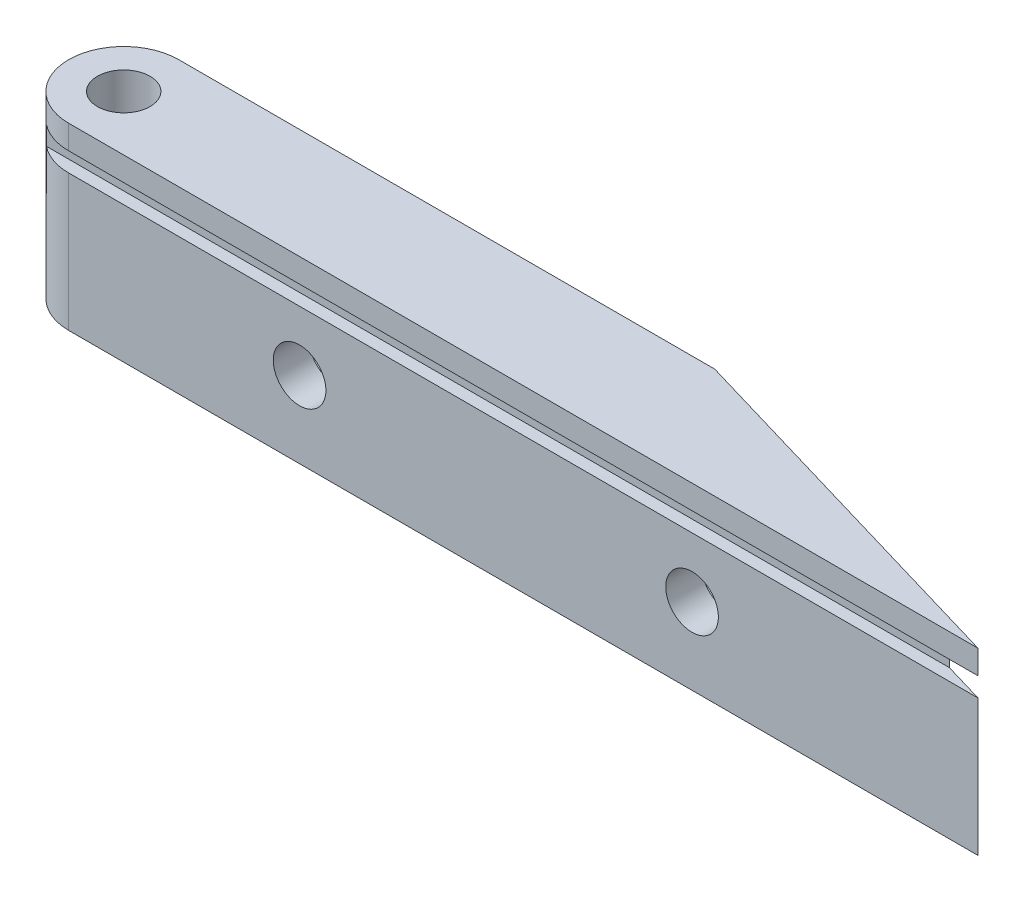
ISO-10303-21;
HEADER;
FILE_DESCRIPTION(('STEP AP214'),'2;1');
FILE_NAME('part.step','',(''),(''),'','','');
FILE_SCHEMA(('AUTOMOTIVE_DESIGN { 1 0 10303 214 1 1 1 1 }'));
ENDSEC;
DATA;
#1=APPLICATION_CONTEXT('core data for automotive mechanical design processes');
#2=APPLICATION_PROTOCOL_DEFINITION('international standard','automotive_design',2000,#1);
#3=PRODUCT_CONTEXT('',#1,'mechanical');
#4=PRODUCT('Part','Part','',(#3));
#5=PRODUCT_RELATED_PRODUCT_CATEGORY('part','',(#4));
#6=PRODUCT_DEFINITION_FORMATION('','',#4);
#7=PRODUCT_DEFINITION_CONTEXT('part definition',#1,'design');
#8=PRODUCT_DEFINITION('design','',#6,#7);
#9=PRODUCT_DEFINITION_SHAPE('','',#8);
#10=(LENGTH_UNIT() NAMED_UNIT(*) SI_UNIT(.MILLI.,.METRE.));
#11=(NAMED_UNIT(*) PLANE_ANGLE_UNIT() SI_UNIT($,.RADIAN.));
#12=(NAMED_UNIT(*) SI_UNIT($,.STERADIAN.) SOLID_ANGLE_UNIT());
#13=UNCERTAINTY_MEASURE_WITH_UNIT(LENGTH_MEASURE(1.E-05),#10,'distance_accuracy_value','');
#14=(GEOMETRIC_REPRESENTATION_CONTEXT(3) GLOBAL_UNCERTAINTY_ASSIGNED_CONTEXT((#13)) GLOBAL_UNIT_ASSIGNED_CONTEXT((#10,
#11,#12)) REPRESENTATION_CONTEXT('',''));
#15=CARTESIAN_POINT('',(0.,0.,0.));
#16=DIRECTION('',(0.,0.,1.));
#17=DIRECTION('',(1.,0.,0.));
#18=AXIS2_PLACEMENT_3D('',#15,#16,#17);
#19=CARTESIAN_POINT('',(22.1200000000001,7.5,1.79999999999999));
#20=DIRECTION('',(0.,0.,-1.));
#21=DIRECTION('',(-1.,0.,0.));
#22=AXIS2_PLACEMENT_3D('',#19,#20,#21);
#23=PLANE('',#22);
#24=DIRECTION('',(0.,-1.,0.));
#25=VECTOR('',#24,1.);
#26=CARTESIAN_POINT('',(-15.8799999999999,7.5,1.8));
#27=LINE('',#26,#25);
#28=CARTESIAN_POINT('',(-15.8799999999999,7.5,1.8));
#29=VERTEX_POINT('',#28);
#30=CARTESIAN_POINT('',(-15.8799999999999,6.49999999999999,1.8));
#31=VERTEX_POINT('',#30);
#32=EDGE_CURVE('E197',#29,#31,#27,.T.);
#33=ORIENTED_EDGE('',*,*,#32,.T.);
#34=DIRECTION('',(1.,0.,0.));
#35=VECTOR('',#34,1.);
#36=CARTESIAN_POINT('',(22.1200000000001,6.5,1.79999999999999));
#37=LINE('',#36,#35);
#38=CARTESIAN_POINT('',(22.1200000000001,6.5,1.8));
#39=VERTEX_POINT('',#38);
#40=EDGE_CURVE('E61',#31,#39,#37,.T.);
#41=ORIENTED_EDGE('',*,*,#40,.T.);
#42=DIRECTION('',(0.,-1.,0.));
#43=VECTOR('',#42,1.);
#44=CARTESIAN_POINT('',(22.1200000000001,7.5,1.79999999999999));
#45=LINE('',#44,#43);
#46=CARTESIAN_POINT('',(22.1200000000001,7.5,1.79999999999999));
#47=VERTEX_POINT('',#46);
#48=EDGE_CURVE('E185',#47,#39,#45,.T.);
#49=ORIENTED_EDGE('',*,*,#48,.F.);
#50=DIRECTION('',(1.,0.,0.));
#51=VECTOR('',#50,1.);
#52=CARTESIAN_POINT('',(22.1200000000001,7.5,1.79999999999999));
#53=LINE('',#52,#51);
#54=EDGE_CURVE('E321',#29,#47,#53,.T.);
#55=ORIENTED_EDGE('',*,*,#54,.F.);
#56=EDGE_LOOP('',(#33,#41,#49,#55));
#57=FACE_BOUND('',#56,.T.);
#58=ADVANCED_FACE('F51',(#57),#23,.F.);
#59=CARTESIAN_POINT('',(-15.8799999999999,7.5,-0.500000000000001));
#60=DIRECTION('',(0.,-1.,0.));
#61=DIRECTION('',(0.,0.,-1.));
#62=AXIS2_PLACEMENT_3D('',#59,#60,#61);
#63=CYLINDRICAL_SURFACE('',#62,1.1);
#64=CARTESIAN_POINT('',(-15.8799999999999,7.5,-0.500000000000001));
#65=DIRECTION('',(0.,1.,0.));
#66=DIRECTION('',(0.,0.,1.));
#67=AXIS2_PLACEMENT_3D('',#64,#65,#66);
#68=CIRCLE('',#67,1.1);
#69=CARTESIAN_POINT('',(-15.8799999999999,7.5,0.6));
#70=VERTEX_POINT('',#69);
#71=EDGE_CURVE('E309',#70,#70,#68,.T.);
#72=ORIENTED_EDGE('',*,*,#71,.T.);
#73=EDGE_LOOP('',(#72));
#74=FACE_BOUND('',#73,.T.);
#75=CARTESIAN_POINT('',(-15.8799999999999,0.,-0.500000000000001));
#76=DIRECTION('',(0.,1.,0.));
#77=DIRECTION('',(0.,0.,1.));
#78=AXIS2_PLACEMENT_3D('',#75,#76,#77);
#79=CIRCLE('',#78,1.1);
#80=CARTESIAN_POINT('',(-15.8799999999999,0.,0.6));
#81=VERTEX_POINT('',#80);
#82=EDGE_CURVE('E299',#81,#81,#79,.T.);
#83=ORIENTED_EDGE('',*,*,#82,.F.);
#84=EDGE_LOOP('',(#83));
#85=FACE_BOUND('',#84,.T.);
#86=ADVANCED_FACE('F455',(#74,#85),#63,.F.);
#87=CARTESIAN_POINT('',(-15.8799999999999,7.,-0.500000000000001));
#88=DIRECTION('',(0.,1.,0.));
#89=DIRECTION('',(0.,0.,1.));
#90=AXIS2_PLACEMENT_3D('',#87,#88,#89);
#91=PLANE('',#90);
#92=DIRECTION('',(0.,0.,1.));
#93=VECTOR('',#92,1.);
#94=CARTESIAN_POINT('',(-15.8799999999999,7.,0.299999999999997));
#95=LINE('',#94,#93);
#96=CARTESIAN_POINT('',(-15.8799999999999,7.,1.1));
#97=VERTEX_POINT('',#96);
#98=CARTESIAN_POINT('',(-15.8799999999999,7.,1.3));
#99=VERTEX_POINT('',#98);
#100=EDGE_CURVE('E255',#97,#99,#95,.T.);
#101=ORIENTED_EDGE('',*,*,#100,.T.);
#102=CARTESIAN_POINT('',(-15.8799999999999,7.,-0.500000000000001));
#103=DIRECTION('',(0.,1.,0.));
#104=DIRECTION('',(0.,0.,1.));
#105=AXIS2_PLACEMENT_3D('',#102,#103,#104);
#106=CIRCLE('',#105,1.8);
#107=CARTESIAN_POINT('',(-15.8799999999999,7.,-2.3));
#108=VERTEX_POINT('',#107);
#109=EDGE_CURVE('E269',#108,#99,#106,.T.);
#110=ORIENTED_EDGE('',*,*,#109,.F.);
#111=DIRECTION('',(0.,0.,-1.));
#112=VECTOR('',#111,1.);
#113=CARTESIAN_POINT('',(-15.8799999999999,7.,-2.8));
#114=LINE('',#113,#112);
#115=CARTESIAN_POINT('',(-15.8799999999999,7.,-2.8));
#116=VERTEX_POINT('',#115);
#117=EDGE_CURVE('E300',#108,#116,#114,.T.);
#118=ORIENTED_EDGE('',*,*,#117,.T.);
#119=DIRECTION('',(-1.,0.,0.));
#120=VECTOR('',#119,1.);
#121=CARTESIAN_POINT('',(-15.8799999999999,7.,-2.8));
#122=LINE('',#121,#120);
#123=CARTESIAN_POINT('',(6.5200000000001,7.,-2.8));
#124=VERTEX_POINT('',#123);
#125=EDGE_CURVE('E268',#124,#116,#122,.T.);
#126=ORIENTED_EDGE('',*,*,#125,.F.);
#127=DIRECTION('',(-0.959169457756016,0.,-0.282832019594723));
#128=VECTOR('',#127,1.);
#129=CARTESIAN_POINT('',(6.5200000000001,7.,-2.8));
#130=LINE('',#129,#128);
#131=CARTESIAN_POINT('',(17.0330434782609,7.,0.299999999999997));
#132=VERTEX_POINT('',#131);
#133=EDGE_CURVE('E273',#132,#124,#130,.T.);
#134=ORIENTED_EDGE('',*,*,#133,.F.);
#135=DIRECTION('',(1.,0.,0.));
#136=VECTOR('',#135,1.);
#137=CARTESIAN_POINT('',(-15.8799999999999,7.,0.299999999999997));
#138=LINE('',#137,#136);
#139=CARTESIAN_POINT('',(-14.4943593539448,7.,0.299999999999997));
#140=VERTEX_POINT('',#139);
#141=EDGE_CURVE('E251',#140,#132,#138,.T.);
#142=ORIENTED_EDGE('',*,*,#141,.F.);
#143=CARTESIAN_POINT('',(-15.8799999999999,7.,-0.500000000000001));
#144=DIRECTION('',(0.,1.,0.));
#145=DIRECTION('',(0.,0.,1.));
#146=AXIS2_PLACEMENT_3D('',#143,#144,#145);
#147=CIRCLE('',#146,1.6);
#148=EDGE_CURVE('E275',#140,#97,#147,.T.);
#149=ORIENTED_EDGE('',*,*,#148,.T.);
#150=EDGE_LOOP('',(#101,#110,#118,#126,#134,#142,#149));
#151=FACE_BOUND('',#150,.T.);
#152=ADVANCED_FACE('F377',(#151),#91,.F.);
#153=CARTESIAN_POINT('',(-15.8799999999999,0.5,-0.500000000000001));
#154=DIRECTION('',(0.,1.,0.));
#155=DIRECTION('',(0.,0.,1.));
#156=AXIS2_PLACEMENT_3D('',#153,#154,#155);
#157=PLANE('',#156);
#158=CARTESIAN_POINT('',(-15.8799999999999,0.5,-0.500000000000001));
#159=DIRECTION('',(0.,1.,0.));
#160=DIRECTION('',(0.,0.,1.));
#161=AXIS2_PLACEMENT_3D('',#158,#159,#160);
#162=CIRCLE('',#161,1.8);
#163=CARTESIAN_POINT('',(-15.8799999999999,0.5,-2.3));
#164=VERTEX_POINT('',#163);
#165=CARTESIAN_POINT('',(-15.8799999999999,0.5,1.3));
#166=VERTEX_POINT('',#165);
#167=EDGE_CURVE('E279',#164,#166,#162,.T.);
#168=ORIENTED_EDGE('',*,*,#167,.T.);
#169=DIRECTION('',(0.,0.,1.));
#170=VECTOR('',#169,1.);
#171=CARTESIAN_POINT('',(-15.8799999999999,0.5,0.299999999999997));
#172=LINE('',#171,#170);
#173=CARTESIAN_POINT('',(-15.8799999999999,0.5,1.1));
#174=VERTEX_POINT('',#173);
#175=EDGE_CURVE('E258',#174,#166,#172,.T.);
#176=ORIENTED_EDGE('',*,*,#175,.F.);
#177=CARTESIAN_POINT('',(-15.8799999999999,0.5,-0.500000000000001));
#178=DIRECTION('',(0.,1.,0.));
#179=DIRECTION('',(0.,0.,1.));
#180=AXIS2_PLACEMENT_3D('',#177,#178,#179);
#181=CIRCLE('',#180,1.6);
#182=CARTESIAN_POINT('',(-14.4943593539448,0.5,0.299999999999997));
#183=VERTEX_POINT('',#182);
#184=EDGE_CURVE('E262',#183,#174,#181,.T.);
#185=ORIENTED_EDGE('',*,*,#184,.F.);
#186=DIRECTION('',(-1.,0.,0.));
#187=VECTOR('',#186,1.);
#188=CARTESIAN_POINT('',(20.424347826087,0.5,0.299999999999997));
#189=LINE('',#188,#187);
#190=CARTESIAN_POINT('',(17.0330434782609,0.5,0.299999999999997));
#191=VERTEX_POINT('',#190);
#192=EDGE_CURVE('E77',#191,#183,#189,.T.);
#193=ORIENTED_EDGE('',*,*,#192,.F.);
#194=DIRECTION('',(-0.959169457756016,0.,-0.282832019594723));
#195=VECTOR('',#194,1.);
#196=CARTESIAN_POINT('',(6.5200000000001,0.5,-2.8));
#197=LINE('',#196,#195);
#198=CARTESIAN_POINT('',(6.5200000000001,0.5,-2.8));
#199=VERTEX_POINT('',#198);
#200=EDGE_CURVE('E283',#191,#199,#197,.T.);
#201=ORIENTED_EDGE('',*,*,#200,.T.);
#202=DIRECTION('',(-1.,0.,0.));
#203=VECTOR('',#202,1.);
#204=CARTESIAN_POINT('',(-15.8799999999999,0.5,-2.8));
#205=LINE('',#204,#203);
#206=CARTESIAN_POINT('',(-15.8799999999999,0.5,-2.8));
#207=VERTEX_POINT('',#206);
#208=EDGE_CURVE('E274',#199,#207,#205,.T.);
#209=ORIENTED_EDGE('',*,*,#208,.T.);
#210=DIRECTION('',(0.,0.,-1.));
#211=VECTOR('',#210,1.);
#212=CARTESIAN_POINT('',(-15.8799999999999,0.5,-2.8));
#213=LINE('',#212,#211);
#214=EDGE_CURVE('E295',#164,#207,#213,.T.);
#215=ORIENTED_EDGE('',*,*,#214,.F.);
#216=EDGE_LOOP('',(#168,#176,#185,#193,#201,#209,#215));
#217=FACE_BOUND('',#216,.T.);
#218=ADVANCED_FACE('F367',(#217),#157,.T.);
#219=CARTESIAN_POINT('',(-15.8799999999999,7.5,-0.500000000000001));
#220=DIRECTION('',(0.,-1.,0.));
#221=DIRECTION('',(0.,0.,-1.));
#222=AXIS2_PLACEMENT_3D('',#219,#220,#221);
#223=CYLINDRICAL_SURFACE('',#222,1.6);
#224=DIRECTION('',(0.,-1.,0.));
#225=VECTOR('',#224,1.);
#226=CARTESIAN_POINT('',(-15.8799999999999,7.5,1.1));
#227=LINE('',#226,#225);
#228=EDGE_CURVE('E204',#97,#174,#227,.T.);
#229=ORIENTED_EDGE('',*,*,#228,.F.);
#230=ORIENTED_EDGE('',*,*,#148,.F.);
#231=DIRECTION('',(0.,-1.,0.));
#232=VECTOR('',#231,1.);
#233=CARTESIAN_POINT('',(-14.4943593539448,7.5,0.299999999999997));
#234=LINE('',#233,#232);
#235=EDGE_CURVE('E201',#140,#183,#234,.T.);
#236=ORIENTED_EDGE('',*,*,#235,.T.);
#237=ORIENTED_EDGE('',*,*,#184,.T.);
#238=EDGE_LOOP('',(#229,#230,#236,#237));
#239=FACE_BOUND('',#238,.T.);
#240=ADVANCED_FACE('F371',(#239),#223,.T.);
#241=CARTESIAN_POINT('',(6.5200000000001,7.5,-2.8));
#242=DIRECTION('',(-0.282832019594723,0.,0.959169457756016));
#243=DIRECTION('',(0.959169457756016,0.,0.282832019594723));
#244=AXIS2_PLACEMENT_3D('',#241,#242,#243);
#245=PLANE('',#244);
#246=ORIENTED_EDGE('',*,*,#48,.T.);
#247=DIRECTION('',(-0.959169457756016,0.,-0.282832019594723));
#248=VECTOR('',#247,1.);
#249=CARTESIAN_POINT('',(6.5200000000001,6.49999999999999,-2.8));
#250=LINE('',#249,#248);
#251=CARTESIAN_POINT('',(20.4277391304349,6.5,1.301));
#252=VERTEX_POINT('',#251);
#253=EDGE_CURVE('E244',#39,#252,#250,.T.);
#254=ORIENTED_EDGE('',*,*,#253,.T.);
#255=DIRECTION('',(0.,1.,0.));
#256=VECTOR('',#255,1.);
#257=CARTESIAN_POINT('',(20.4277391304349,7.5,1.301));
#258=LINE('',#257,#256);
#259=CARTESIAN_POINT('',(20.4277391304349,5.69999999999999,1.301));
#260=VERTEX_POINT('',#259);
#261=EDGE_CURVE('E176',#260,#252,#258,.T.);
#262=ORIENTED_EDGE('',*,*,#261,.F.);
#263=DIRECTION('',(0.959169457756016,0.,0.282832019594723));
#264=VECTOR('',#263,1.);
#265=CARTESIAN_POINT('',(6.5200000000001,5.69999999999999,-2.8));
#266=LINE('',#265,#264);
#267=CARTESIAN_POINT('',(22.1200000000001,5.69999999999999,1.8));
#268=VERTEX_POINT('',#267);
#269=EDGE_CURVE('E161',#260,#268,#266,.T.);
#270=ORIENTED_EDGE('',*,*,#269,.T.);
#271=CARTESIAN_POINT('',(22.1200000000001,0.,1.79999999999999));
#272=VERTEX_POINT('',#271);
#273=EDGE_CURVE('E173',#268,#272,#45,.T.);
#274=ORIENTED_EDGE('',*,*,#273,.T.);
#275=DIRECTION('',(-0.959169457756016,0.,-0.282832019594723));
#276=VECTOR('',#275,1.);
#277=CARTESIAN_POINT('',(6.5200000000001,0.,-2.8));
#278=LINE('',#277,#276);
#279=CARTESIAN_POINT('',(6.5200000000001,0.,-2.8));
#280=VERTEX_POINT('',#279);
#281=EDGE_CURVE('E337',#272,#280,#278,.T.);
#282=ORIENTED_EDGE('',*,*,#281,.T.);
#283=DIRECTION('',(0.,-1.,0.));
#284=VECTOR('',#283,1.);
#285=CARTESIAN_POINT('',(6.5200000000001,7.5,-2.8));
#286=LINE('',#285,#284);
#287=EDGE_CURVE('E193',#199,#280,#286,.T.);
#288=ORIENTED_EDGE('',*,*,#287,.F.);
#289=ORIENTED_EDGE('',*,*,#200,.F.);
#290=DIRECTION('',(0.,1.,0.));
#291=VECTOR('',#290,1.);
#292=CARTESIAN_POINT('',(17.0330434782609,0.,0.299999999999997));
#293=LINE('',#292,#291);
#294=EDGE_CURVE('E167',#191,#132,#293,.T.);
#295=ORIENTED_EDGE('',*,*,#294,.T.);
#296=ORIENTED_EDGE('',*,*,#133,.T.);
#297=CARTESIAN_POINT('',(6.5200000000001,7.5,-2.8));
#298=VERTEX_POINT('',#297);
#299=EDGE_CURVE('E186',#298,#124,#286,.T.);
#300=ORIENTED_EDGE('',*,*,#299,.F.);
#301=DIRECTION('',(-0.959169457756016,0.,-0.282832019594723));
#302=VECTOR('',#301,1.);
#303=CARTESIAN_POINT('',(6.5200000000001,7.5,-2.8));
#304=LINE('',#303,#302);
#305=EDGE_CURVE('E325',#47,#298,#304,.T.);
#306=ORIENTED_EDGE('',*,*,#305,.F.);
#307=EDGE_LOOP('',(#246,#254,#262,#270,#274,#282,#288,#289,#295,#296,#300,#306));
#308=FACE_BOUND('',#307,.T.);
#309=ADVANCED_FACE('F172',(#308),#245,.F.);
#310=CARTESIAN_POINT('',(-15.8799999999999,7.5,-2.8));
#311=DIRECTION('',(0.,0.,1.));
#312=DIRECTION('',(1.,0.,0.));
#313=AXIS2_PLACEMENT_3D('',#310,#311,#312);
#314=PLANE('',#313);
#315=ORIENTED_EDGE('',*,*,#208,.F.);
#316=ORIENTED_EDGE('',*,*,#287,.T.);
#317=DIRECTION('',(-1.,0.,0.));
#318=VECTOR('',#317,1.);
#319=CARTESIAN_POINT('',(-15.8799999999999,0.,-2.8));
#320=LINE('',#319,#318);
#321=CARTESIAN_POINT('',(-15.8799999999999,0.,-2.8));
#322=VERTEX_POINT('',#321);
#323=EDGE_CURVE('E322',#280,#322,#320,.T.);
#324=ORIENTED_EDGE('',*,*,#323,.T.);
#325=DIRECTION('',(0.,-1.,0.));
#326=VECTOR('',#325,1.);
#327=CARTESIAN_POINT('',(-15.8799999999999,7.5,-2.8));
#328=LINE('',#327,#326);
#329=EDGE_CURVE('E331',#207,#322,#328,.T.);
#330=ORIENTED_EDGE('',*,*,#329,.F.);
#331=EDGE_LOOP('',(#315,#316,#324,#330));
#332=FACE_BOUND('',#331,.T.);
#333=ADVANCED_FACE('F360',(#332),#314,.F.);
#334=CARTESIAN_POINT('',(-15.8799999999999,7.5,-0.500000000000001));
#335=DIRECTION('',(0.,1.,0.));
#336=DIRECTION('',(0.,0.,1.));
#337=AXIS2_PLACEMENT_3D('',#334,#335,#336);
#338=PLANE('',#337);
#339=CARTESIAN_POINT('',(-15.8799999999999,7.5,-0.500000000000001));
#340=DIRECTION('',(0.,1.,0.));
#341=DIRECTION('',(0.,0.,1.));
#342=AXIS2_PLACEMENT_3D('',#339,#340,#341);
#343=CIRCLE('',#342,2.3);
#344=CARTESIAN_POINT('',(-15.8799999999999,7.5,-2.8));
#345=VERTEX_POINT('',#344);
#346=EDGE_CURVE('E317',#345,#29,#343,.T.);
#347=ORIENTED_EDGE('',*,*,#346,.T.);
#348=ORIENTED_EDGE('',*,*,#54,.T.);
#349=ORIENTED_EDGE('',*,*,#305,.T.);
#350=DIRECTION('',(-1.,0.,0.));
#351=VECTOR('',#350,1.);
#352=CARTESIAN_POINT('',(-15.8799999999999,7.5,-2.8));
#353=LINE('',#352,#351);
#354=EDGE_CURVE('E328',#298,#345,#353,.T.);
#355=ORIENTED_EDGE('',*,*,#354,.T.);
#356=EDGE_LOOP('',(#347,#348,#349,#355));
#357=FACE_BOUND('',#356,.T.);
#358=ORIENTED_EDGE('',*,*,#71,.F.);
#359=EDGE_LOOP('',(#358));
#360=FACE_BOUND('',#359,.T.);
#361=ADVANCED_FACE('F386',(#357,#360),#338,.T.);
#362=CARTESIAN_POINT('',(-15.8799999999999,0.,-0.500000000000001));
#363=DIRECTION('',(0.,1.,0.));
#364=DIRECTION('',(0.,0.,1.));
#365=AXIS2_PLACEMENT_3D('',#362,#363,#364);
#366=PLANE('',#365);
#367=CARTESIAN_POINT('',(-15.8799999999999,0.,-0.500000000000001));
#368=DIRECTION('',(0.,1.,0.));
#369=DIRECTION('',(0.,0.,1.));
#370=AXIS2_PLACEMENT_3D('',#367,#368,#369);
#371=CIRCLE('',#370,2.3);
#372=CARTESIAN_POINT('',(-15.8799999999999,0.,1.8));
#373=VERTEX_POINT('',#372);
#374=EDGE_CURVE('E313',#322,#373,#371,.T.);
#375=ORIENTED_EDGE('',*,*,#374,.F.);
#376=ORIENTED_EDGE('',*,*,#323,.F.);
#377=ORIENTED_EDGE('',*,*,#281,.F.);
#378=DIRECTION('',(1.,0.,0.));
#379=VECTOR('',#378,1.);
#380=CARTESIAN_POINT('',(22.1200000000001,0.,1.79999999999999));
#381=LINE('',#380,#379);
#382=EDGE_CURVE('E182',#373,#272,#381,.T.);
#383=ORIENTED_EDGE('',*,*,#382,.F.);
#384=EDGE_LOOP('',(#375,#376,#377,#383));
#385=FACE_BOUND('',#384,.T.);
#386=ORIENTED_EDGE('',*,*,#82,.T.);
#387=EDGE_LOOP('',(#386));
#388=FACE_BOUND('',#387,.T.);
#389=ADVANCED_FACE('F363',(#385,#388),#366,.F.);
#390=CARTESIAN_POINT('',(-15.8799999999999,7.5,-0.500000000000001));
#391=DIRECTION('',(0.,-1.,0.));
#392=DIRECTION('',(0.,0.,-1.));
#393=AXIS2_PLACEMENT_3D('',#390,#391,#392);
#394=CYLINDRICAL_SURFACE('',#393,2.3);
#395=DIRECTION('',(0.,-1.,0.));
#396=VECTOR('',#395,1.);
#397=CARTESIAN_POINT('',(-17.3105240298575,7.5,1.301));
#398=LINE('',#397,#396);
#399=CARTESIAN_POINT('',(-17.3105240298575,6.49999999999999,1.301));
#400=VERTEX_POINT('',#399);
#401=CARTESIAN_POINT('',(-17.3105240298575,5.69999999999999,1.301));
#402=VERTEX_POINT('',#401);
#403=EDGE_CURVE('E11',#400,#402,#398,.T.);
#404=ORIENTED_EDGE('',*,*,#403,.F.);
#405=CARTESIAN_POINT('',(-15.8799999999999,6.49999999999999,-0.500000000000001));
#406=DIRECTION('',(0.,1.,0.));
#407=DIRECTION('',(-1.,0.,0.));
#408=AXIS2_PLACEMENT_3D('',#405,#406,#407);
#409=CIRCLE('',#408,2.3);
#410=EDGE_CURVE('E178',#400,#31,#409,.T.);
#411=ORIENTED_EDGE('',*,*,#410,.T.);
#412=ORIENTED_EDGE('',*,*,#32,.F.);
#413=ORIENTED_EDGE('',*,*,#346,.F.);
#414=EDGE_CURVE('E342',#345,#116,#328,.T.);
#415=ORIENTED_EDGE('',*,*,#414,.T.);
#416=DIRECTION('',(0.,-1.,0.));
#417=VECTOR('',#416,1.);
#418=CARTESIAN_POINT('',(-15.8799999999999,7.5,-2.8));
#419=LINE('',#418,#417);
#420=EDGE_CURVE('E263',#116,#207,#419,.T.);
#421=ORIENTED_EDGE('',*,*,#420,.T.);
#422=ORIENTED_EDGE('',*,*,#329,.T.);
#423=ORIENTED_EDGE('',*,*,#374,.T.);
#424=CARTESIAN_POINT('',(-15.8799999999999,5.69999999999999,1.8));
#425=VERTEX_POINT('',#424);
#426=EDGE_CURVE('E191',#425,#373,#27,.T.);
#427=ORIENTED_EDGE('',*,*,#426,.F.);
#428=CARTESIAN_POINT('',(-15.8799999999999,5.69999999999999,-0.500000000000001));
#429=DIRECTION('',(0.,-1.,0.));
#430=DIRECTION('',(1.,0.,0.));
#431=AXIS2_PLACEMENT_3D('',#428,#429,#430);
#432=CIRCLE('',#431,2.3);
#433=EDGE_CURVE('E69',#425,#402,#432,.T.);
#434=ORIENTED_EDGE('',*,*,#433,.T.);
#435=EDGE_LOOP('',(#404,#411,#412,#413,#415,#421,#422,#423,#427,#434));
#436=FACE_BOUND('',#435,.T.);
#437=ADVANCED_FACE('F53',(#436),#394,.T.);
#438=CARTESIAN_POINT('',(-6.22999999999994,3.2,1.8));
#439=DIRECTION('',(0.,0.,1.));
#440=DIRECTION('',(1.,0.,0.));
#441=AXIS2_PLACEMENT_3D('',#438,#439,#440);
#442=CIRCLE('',#441,1.1);
#443=CARTESIAN_POINT('',(-5.12999999999994,3.2,1.8));
#444=VERTEX_POINT('',#443);
#445=EDGE_CURVE('E215',#444,#444,#442,.T.);
#446=ORIENTED_EDGE('',*,*,#445,.F.);
#447=EDGE_LOOP('',(#446));
#448=FACE_BOUND('',#447,.T.);
#449=CARTESIAN_POINT('',(10.1714000000001,3.2,1.8));
#450=DIRECTION('',(0.,0.,1.));
#451=DIRECTION('',(1.,0.,0.));
#452=AXIS2_PLACEMENT_3D('',#449,#450,#451);
#453=CIRCLE('',#452,1.1);
#454=CARTESIAN_POINT('',(11.2714000000001,3.2,1.8));
#455=VERTEX_POINT('',#454);
#456=EDGE_CURVE('E224',#455,#455,#453,.T.);
#457=ORIENTED_EDGE('',*,*,#456,.F.);
#458=EDGE_LOOP('',(#457));
#459=FACE_BOUND('',#458,.T.);
#460=ORIENTED_EDGE('',*,*,#273,.F.);
#461=DIRECTION('',(-1.,0.,0.));
#462=VECTOR('',#461,1.);
#463=CARTESIAN_POINT('',(22.1200000000001,5.69999999999999,1.79999999999999));
#464=LINE('',#463,#462);
#465=EDGE_CURVE('E158',#268,#425,#464,.T.);
#466=ORIENTED_EDGE('',*,*,#465,.T.);
#467=ORIENTED_EDGE('',*,*,#426,.T.);
#468=ORIENTED_EDGE('',*,*,#382,.T.);
#469=EDGE_LOOP('',(#460,#466,#467,#468));
#470=FACE_BOUND('',#469,.T.);
#471=ADVANCED_FACE('F180',(#448,#459,#470),#23,.F.);
#472=ORIENTED_EDGE('',*,*,#299,.T.);
#473=ORIENTED_EDGE('',*,*,#125,.T.);
#474=ORIENTED_EDGE('',*,*,#414,.F.);
#475=ORIENTED_EDGE('',*,*,#354,.F.);
#476=EDGE_LOOP('',(#472,#473,#474,#475));
#477=FACE_BOUND('',#476,.T.);
#478=ADVANCED_FACE('F384',(#477),#314,.F.);
#479=CARTESIAN_POINT('',(-15.8799999999999,7.5,-2.8));
#480=DIRECTION('',(-1.,0.,0.));
#481=DIRECTION('',(0.,-1.,0.));
#482=AXIS2_PLACEMENT_3D('',#479,#480,#481);
#483=PLANE('',#482);
#484=ORIENTED_EDGE('',*,*,#420,.F.);
#485=ORIENTED_EDGE('',*,*,#117,.F.);
#486=DIRECTION('',(0.,-1.,0.));
#487=VECTOR('',#486,1.);
#488=CARTESIAN_POINT('',(-15.8799999999999,3.75,-2.3));
#489=LINE('',#488,#487);
#490=EDGE_CURVE('E286',#108,#164,#489,.T.);
#491=ORIENTED_EDGE('',*,*,#490,.T.);
#492=ORIENTED_EDGE('',*,*,#214,.T.);
#493=EDGE_LOOP('',(#484,#485,#491,#492));
#494=FACE_BOUND('',#493,.T.);
#495=ADVANCED_FACE('F466',(#494),#483,.F.);
#496=CARTESIAN_POINT('',(-15.8799999999999,7.5,-0.500000000000001));
#497=DIRECTION('',(0.,-1.,0.));
#498=DIRECTION('',(0.,0.,-1.));
#499=AXIS2_PLACEMENT_3D('',#496,#497,#498);
#500=CYLINDRICAL_SURFACE('',#499,1.8);
#501=ORIENTED_EDGE('',*,*,#167,.F.);
#502=ORIENTED_EDGE('',*,*,#490,.F.);
#503=ORIENTED_EDGE('',*,*,#109,.T.);
#504=DIRECTION('',(0.,1.,0.));
#505=VECTOR('',#504,1.);
#506=CARTESIAN_POINT('',(-15.8799999999999,7.5,1.3));
#507=LINE('',#506,#505);
#508=EDGE_CURVE('E267',#99,#166,#507,.F.);
#509=ORIENTED_EDGE('',*,*,#508,.T.);
#510=EDGE_LOOP('',(#501,#502,#503,#509));
#511=FACE_BOUND('',#510,.T.);
#512=ADVANCED_FACE('F483',(#511),#500,.F.);
#513=CARTESIAN_POINT('',(0.,0.,0.299999999999997));
#514=DIRECTION('',(0.,0.,-1.));
#515=DIRECTION('',(-1.,0.,0.));
#516=AXIS2_PLACEMENT_3D('',#513,#514,#515);
#517=PLANE('',#516);
#518=CARTESIAN_POINT('',(-6.22999999999994,3.2,0.299999999999997));
#519=DIRECTION('',(0.,0.,-1.));
#520=DIRECTION('',(-1.,0.,0.));
#521=AXIS2_PLACEMENT_3D('',#518,#519,#520);
#522=CIRCLE('',#521,1.1);
#523=CARTESIAN_POINT('',(-7.32999999999994,3.2,0.299999999999997));
#524=VERTEX_POINT('',#523);
#525=EDGE_CURVE('E55',#524,#524,#522,.T.);
#526=ORIENTED_EDGE('',*,*,#525,.F.);
#527=EDGE_LOOP('',(#526));
#528=FACE_BOUND('',#527,.T.);
#529=CARTESIAN_POINT('',(10.1714000000001,3.2,0.299999999999997));
#530=DIRECTION('',(0.,0.,-1.));
#531=DIRECTION('',(-1.,0.,0.));
#532=AXIS2_PLACEMENT_3D('',#529,#530,#531);
#533=CIRCLE('',#532,1.1);
#534=CARTESIAN_POINT('',(9.07140000000007,3.2,0.299999999999997));
#535=VERTEX_POINT('',#534);
#536=EDGE_CURVE('E212',#535,#535,#533,.T.);
#537=ORIENTED_EDGE('',*,*,#536,.F.);
#538=EDGE_LOOP('',(#537));
#539=FACE_BOUND('',#538,.T.);
#540=ORIENTED_EDGE('',*,*,#294,.F.);
#541=ORIENTED_EDGE('',*,*,#192,.T.);
#542=ORIENTED_EDGE('',*,*,#235,.F.);
#543=ORIENTED_EDGE('',*,*,#141,.T.);
#544=EDGE_LOOP('',(#540,#541,#542,#543));
#545=FACE_BOUND('',#544,.T.);
#546=ADVANCED_FACE('F374',(#528,#539,#545),#517,.T.);
#547=CARTESIAN_POINT('',(-15.8799999999999,0.5,0.299999999999997));
#548=DIRECTION('',(1.,0.,0.));
#549=DIRECTION('',(0.,0.,-1.));
#550=AXIS2_PLACEMENT_3D('',#547,#548,#549);
#551=PLANE('',#550);
#552=ORIENTED_EDGE('',*,*,#100,.F.);
#553=ORIENTED_EDGE('',*,*,#228,.T.);
#554=ORIENTED_EDGE('',*,*,#175,.T.);
#555=ORIENTED_EDGE('',*,*,#508,.F.);
#556=EDGE_LOOP('',(#552,#553,#554,#555));
#557=FACE_BOUND('',#556,.T.);
#558=ADVANCED_FACE('F445',(#557),#551,.F.);
#559=CARTESIAN_POINT('',(0.,0.,1.301));
#560=DIRECTION('',(0.,0.,1.));
#561=DIRECTION('',(1.,0.,0.));
#562=AXIS2_PLACEMENT_3D('',#559,#560,#561);
#563=PLANE('',#562);
#564=ORIENTED_EDGE('',*,*,#261,.T.);
#565=DIRECTION('',(-1.,0.,0.));
#566=VECTOR('',#565,1.);
#567=CARTESIAN_POINT('',(66.8280112353159,6.5,1.301));
#568=LINE('',#567,#566);
#569=EDGE_CURVE('E235',#252,#400,#568,.T.);
#570=ORIENTED_EDGE('',*,*,#569,.T.);
#571=ORIENTED_EDGE('',*,*,#403,.T.);
#572=DIRECTION('',(1.,0.,0.));
#573=VECTOR('',#572,1.);
#574=CARTESIAN_POINT('',(66.8280112353159,5.7,1.301));
#575=LINE('',#574,#573);
#576=EDGE_CURVE('E222',#402,#260,#575,.T.);
#577=ORIENTED_EDGE('',*,*,#576,.T.);
#578=EDGE_LOOP('',(#564,#570,#571,#577));
#579=FACE_BOUND('',#578,.T.);
#580=ADVANCED_FACE('F395',(#579),#563,.T.);
#581=CARTESIAN_POINT('',(66.8280112353159,6.5,1.301));
#582=DIRECTION('',(0.,1.,0.));
#583=DIRECTION('',(-1.,0.,0.));
#584=AXIS2_PLACEMENT_3D('',#581,#582,#583);
#585=PLANE('',#584);
#586=ORIENTED_EDGE('',*,*,#40,.F.);
#587=ORIENTED_EDGE('',*,*,#410,.F.);
#588=ORIENTED_EDGE('',*,*,#569,.F.);
#589=ORIENTED_EDGE('',*,*,#253,.F.);
#590=EDGE_LOOP('',(#586,#587,#588,#589));
#591=FACE_BOUND('',#590,.T.);
#592=ADVANCED_FACE('F393',(#591),#585,.F.);
#593=CARTESIAN_POINT('',(66.8280112353159,5.7,1.301));
#594=DIRECTION('',(0.,-1.,0.));
#595=DIRECTION('',(1.,0.,0.));
#596=AXIS2_PLACEMENT_3D('',#593,#594,#595);
#597=PLANE('',#596);
#598=ORIENTED_EDGE('',*,*,#576,.F.);
#599=ORIENTED_EDGE('',*,*,#433,.F.);
#600=ORIENTED_EDGE('',*,*,#465,.F.);
#601=ORIENTED_EDGE('',*,*,#269,.F.);
#602=EDGE_LOOP('',(#598,#599,#600,#601));
#603=FACE_BOUND('',#602,.T.);
#604=ADVANCED_FACE('F160',(#603),#597,.F.);
#605=CARTESIAN_POINT('',(10.1714000000001,3.2,-2.8));
#606=DIRECTION('',(0.,0.,1.));
#607=DIRECTION('',(1.,0.,0.));
#608=AXIS2_PLACEMENT_3D('',#605,#606,#607);
#609=CYLINDRICAL_SURFACE('',#608,1.1);
#610=ORIENTED_EDGE('',*,*,#536,.T.);
#611=EDGE_LOOP('',(#610));
#612=FACE_BOUND('',#611,.T.);
#613=ORIENTED_EDGE('',*,*,#456,.T.);
#614=EDGE_LOOP('',(#613));
#615=FACE_BOUND('',#614,.T.);
#616=ADVANCED_FACE('F471',(#612,#615),#609,.F.);
#617=CARTESIAN_POINT('',(-6.22999999999994,3.2,-2.8));
#618=DIRECTION('',(0.,0.,1.));
#619=DIRECTION('',(1.,0.,0.));
#620=AXIS2_PLACEMENT_3D('',#617,#618,#619);
#621=CYLINDRICAL_SURFACE('',#620,1.1);
#622=ORIENTED_EDGE('',*,*,#525,.T.);
#623=EDGE_LOOP('',(#622));
#624=FACE_BOUND('',#623,.T.);
#625=ORIENTED_EDGE('',*,*,#445,.T.);
#626=EDGE_LOOP('',(#625));
#627=FACE_BOUND('',#626,.T.);
#628=ADVANCED_FACE('F473',(#624,#627),#621,.F.);
#629=CLOSED_SHELL('',(#58,#86,#152,#218,#240,#309,#333,#361,#389,#437,#471,#478,#495,#512,#546,
#558,#580,#592,#604,#616,#628));
#630=MANIFOLD_SOLID_BREP('B2',#629);
#631=ADVANCED_BREP_SHAPE_REPRESENTATION('',(#18,#630),#14);
#632=SHAPE_DEFINITION_REPRESENTATION(#9,#631);
ENDSEC;
END-ISO-10303-21;
